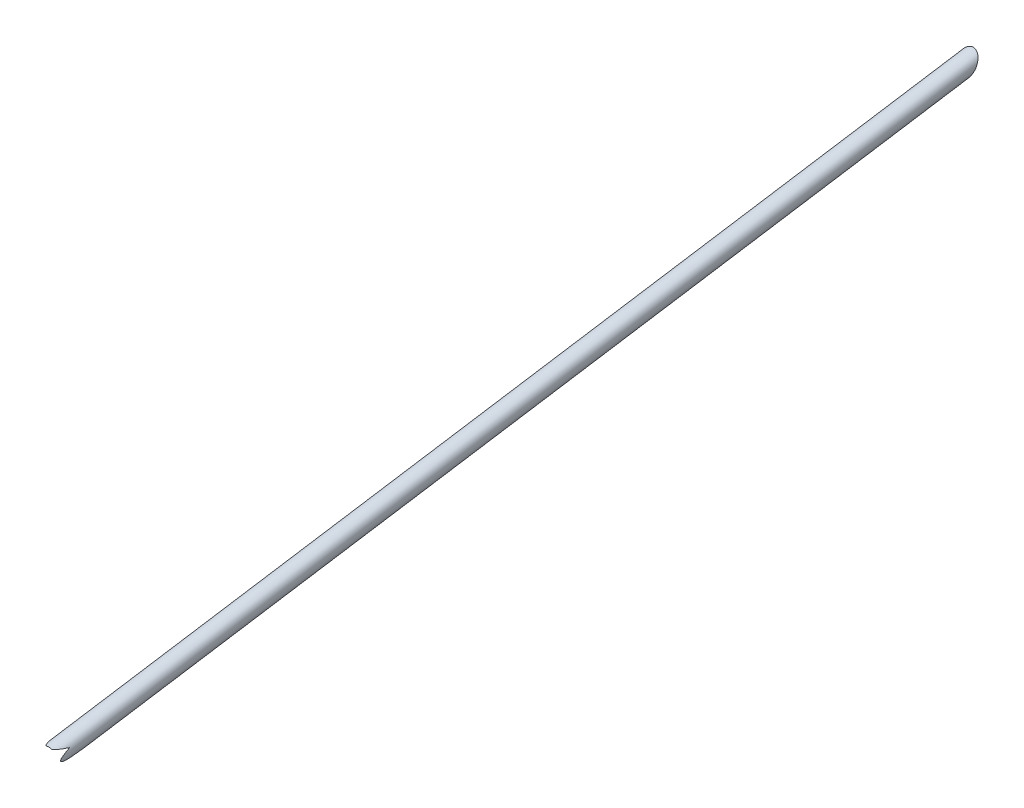
ISO-10303-21;
HEADER;
FILE_DESCRIPTION(('STEP AP214'),'2;1');
FILE_NAME('part.step','',(''),(''),'','','');
FILE_SCHEMA(('AUTOMOTIVE_DESIGN { 1 0 10303 214 1 1 1 1 }'));
ENDSEC;
DATA;
#1=APPLICATION_CONTEXT('core data for automotive mechanical design processes');
#2=APPLICATION_PROTOCOL_DEFINITION('international standard','automotive_design',2000,#1);
#3=PRODUCT_CONTEXT('',#1,'mechanical');
#4=PRODUCT('Part','Part','',(#3));
#5=PRODUCT_RELATED_PRODUCT_CATEGORY('part','',(#4));
#6=PRODUCT_DEFINITION_FORMATION('','',#4);
#7=PRODUCT_DEFINITION_CONTEXT('part definition',#1,'design');
#8=PRODUCT_DEFINITION('design','',#6,#7);
#9=PRODUCT_DEFINITION_SHAPE('','',#8);
#10=(LENGTH_UNIT() NAMED_UNIT(*) SI_UNIT(.MILLI.,.METRE.));
#11=(NAMED_UNIT(*) PLANE_ANGLE_UNIT() SI_UNIT($,.RADIAN.));
#12=(NAMED_UNIT(*) SI_UNIT($,.STERADIAN.) SOLID_ANGLE_UNIT());
#13=UNCERTAINTY_MEASURE_WITH_UNIT(LENGTH_MEASURE(1.E-05),#10,'distance_accuracy_value','');
#14=(GEOMETRIC_REPRESENTATION_CONTEXT(3) GLOBAL_UNCERTAINTY_ASSIGNED_CONTEXT((#13)) GLOBAL_UNIT_ASSIGNED_CONTEXT((#10,
#11,#12)) REPRESENTATION_CONTEXT('',''));
#15=CARTESIAN_POINT('',(0.,0.,0.));
#16=DIRECTION('',(0.,0.,1.));
#17=DIRECTION('',(1.,0.,0.));
#18=AXIS2_PLACEMENT_3D('',#15,#16,#17);
#19=CARTESIAN_POINT('',(150.,2.22044604925031E-13,-825.));
#20=DIRECTION('',(0.20871080944,0.381642622975999,-0.900438063583998));
#21=DIRECTION('',(0.,0.920714591276893,0.390236647958419));
#22=AXIS2_PLACEMENT_3D('',#19,#20,#21);
#23=CYLINDRICAL_SURFACE('',#22,7.90000000000002);
#24=CARTESIAN_POINT('',(169.854654537304,36.305654011071,-910.65865243237));
#25=DIRECTION('',(-0.993532672656404,0.,-0.113546591160732));
#26=DIRECTION('',(0.104852236740751,0.383768850271771,-0.917457071481573));
#27=AXIS2_PLACEMENT_3D('',#24,#25,#26);
#28=ELLIPSE('',#27,75.1526819648488,7.90000000000002);
#29=CARTESIAN_POINT('',(164.232637393375,10.,-861.466002422995));
#30=VERTEX_POINT('',#29);
#31=CARTESIAN_POINT('',(162.115990749984,10.,-842.945344293321));
#32=VERTEX_POINT('',#31);
#33=EDGE_CURVE('E88',#30,#32,#28,.T.);
#34=ORIENTED_EDGE('',*,*,#33,.T.);
#35=CARTESIAN_POINT('',(155.46875,10.,-848.59375));
#36=DIRECTION('',(0.,-1.,0.));
#37=DIRECTION('',(0.225801752353741,0.,-0.974173274440425));
#38=AXIS2_PLACEMENT_3D('',#35,#36,#37);
#39=ELLIPSE('',#38,20.6999939849403,7.90000000000002);
#40=EDGE_CURVE('E96',#32,#30,#39,.T.);
#41=ORIENTED_EDGE('',*,*,#40,.T.);
#42=EDGE_LOOP('',(#34,#41));
#43=FACE_BOUND('',#42,.T.);
#44=CARTESIAN_POINT('',(325.,320.,-1580.));
#45=DIRECTION('',(-0.00416950723616232,-0.393939167319851,-0.919127057408686));
#46=DIRECTION('',(0.2871987901008,0.87994037819309,-0.37844654284329));
#47=AXIS2_PLACEMENT_3D('',#44,#45,#46);
#48=ELLIPSE('',#47,11.6794314327941,7.90000000000002);
#49=CARTESIAN_POINT('',(328.354318576564,330.277203312053,-1584.42004044812));
#50=VERTEX_POINT('',#49);
#51=EDGE_CURVE('E43',#50,#50,#48,.T.);
#52=ORIENTED_EDGE('',*,*,#51,.T.);
#53=EDGE_LOOP('',(#52));
#54=FACE_BOUND('',#53,.T.);
#55=ADVANCED_FACE('F39',(#43,#54),#23,.F.);
#56=CARTESIAN_POINT('',(150.,2.22044604925031E-13,-825.));
#57=DIRECTION('',(0.20871080944,0.381642622975999,-0.900438063583998));
#58=DIRECTION('',(0.,0.920714591276893,0.390236647958419));
#59=AXIS2_PLACEMENT_3D('',#56,#57,#58);
#60=CYLINDRICAL_SURFACE('',#59,9.49999999999999);
#61=CARTESIAN_POINT('',(169.854654537304,36.305654011071,-910.65865243237));
#62=DIRECTION('',(-0.993532672656404,0.,-0.113546591160732));
#63=DIRECTION('',(0.104852236740751,0.383768850271771,-0.917457071481573));
#64=AXIS2_PLACEMENT_3D('',#61,#62,#63);
#65=ELLIPSE('',#64,90.3734783121596,9.49999999999999);
#66=CARTESIAN_POINT('',(165.021102330899,10.,-868.365070626321));
#67=VERTEX_POINT('',#66);
#68=CARTESIAN_POINT('',(161.327525812461,10.,-836.046276089994));
#69=VERTEX_POINT('',#68);
#70=EDGE_CURVE('E86',#67,#69,#65,.T.);
#71=ORIENTED_EDGE('',*,*,#70,.F.);
#72=CARTESIAN_POINT('',(155.46875,10.,-848.59375));
#73=DIRECTION('',(0.,-1.,0.));
#74=DIRECTION('',(0.225801752353741,0.,-0.974173274440425));
#75=AXIS2_PLACEMENT_3D('',#72,#73,#74);
#76=ELLIPSE('',#75,24.8923978299914,9.49999999999999);
#77=CARTESIAN_POINT('',(147.853219182832,10.,-825.504602960222));
#78=VERTEX_POINT('',#77);
#79=EDGE_CURVE('E71',#78,#67,#76,.T.);
#80=ORIENTED_EDGE('',*,*,#79,.F.);
#81=CARTESIAN_POINT('',(150.,3.38448164180527E-13,-825.));
#82=DIRECTION('',(0.0197141066523152,-0.0461644942318043,-0.998739302055958));
#83=DIRECTION('',(0.412111349099456,0.910500714966001,-0.0339512001235191));
#84=AXIS2_PLACEMENT_3D('',#81,#82,#83);
#85=ELLIPSE('',#84,10.7247795684855,9.49999999999999);
#86=CARTESIAN_POINT('',(153.842522857189,10.,-825.386380145553));
#87=VERTEX_POINT('',#86);
#88=EDGE_CURVE('E49',#87,#78,#85,.F.);
#89=ORIENTED_EDGE('',*,*,#88,.F.);
#90=EDGE_CURVE('E82',#69,#87,#76,.T.);
#91=ORIENTED_EDGE('',*,*,#90,.F.);
#92=EDGE_LOOP('',(#71,#80,#89,#91));
#93=FACE_BOUND('',#92,.T.);
#94=CARTESIAN_POINT('',(325.,320.,-1580.));
#95=DIRECTION('',(-0.00416950723616232,-0.393939167319851,-0.919127057408686));
#96=DIRECTION('',(0.2871987901008,0.87994037819309,-0.37844654284329));
#97=AXIS2_PLACEMENT_3D('',#94,#95,#96);
#98=ELLIPSE('',#97,14.0448859001954,9.49999999999999);
#99=CARTESIAN_POINT('',(329.03367423764,332.358662210697,-1585.31523851356));
#100=VERTEX_POINT('',#99);
#101=EDGE_CURVE('E11',#100,#100,#98,.T.);
#102=ORIENTED_EDGE('',*,*,#101,.F.);
#103=EDGE_LOOP('',(#102));
#104=FACE_BOUND('',#103,.T.);
#105=ADVANCED_FACE('F92',(#93,#104),#60,.T.);
#106=CARTESIAN_POINT('',(160.,10.,-825.));
#107=DIRECTION('',(0.,-1.,0.));
#108=DIRECTION('',(0.,0.,-1.));
#109=AXIS2_PLACEMENT_3D('',#106,#107,#108);
#110=PLANE('',#109);
#111=DIRECTION('',(-0.113546591160732,0.,0.993532672656404));
#112=VECTOR('',#111,1.);
#113=CARTESIAN_POINT('',(259.935326726564,10.,-1698.86453408839));
#114=LINE('',#113,#112);
#115=EDGE_CURVE('E90',#32,#69,#114,.T.);
#116=ORIENTED_EDGE('',*,*,#115,.T.);
#117=ORIENTED_EDGE('',*,*,#90,.T.);
#118=CARTESIAN_POINT('',(153.75,10.,-806.250000000001));
#119=DIRECTION('',(0.,-1.,0.));
#120=DIRECTION('',(-0.196116135138185,0.,-0.98058067569092));
#121=AXIS2_PLACEMENT_3D('',#118,#119,#120);
#122=ELLIPSE('',#121,20.4994283456881,9.49999999999999);
#123=EDGE_CURVE('E56',#87,#78,#122,.F.);
#124=ORIENTED_EDGE('',*,*,#123,.T.);
#125=ORIENTED_EDGE('',*,*,#79,.T.);
#126=EDGE_CURVE('E76',#67,#30,#114,.T.);
#127=ORIENTED_EDGE('',*,*,#126,.T.);
#128=ORIENTED_EDGE('',*,*,#40,.F.);
#129=EDGE_LOOP('',(#116,#117,#124,#125,#127,#128));
#130=FACE_BOUND('',#129,.T.);
#131=ADVANCED_FACE('F74',(#130),#110,.T.);
#132=CARTESIAN_POINT('',(259.935326726564,10.,-1698.86453408839));
#133=DIRECTION('',(-0.993532672656404,0.,-0.113546591160732));
#134=DIRECTION('',(-0.113546591160732,0.,0.993532672656404));
#135=AXIS2_PLACEMENT_3D('',#132,#133,#134);
#136=PLANE('',#135);
#137=ORIENTED_EDGE('',*,*,#126,.F.);
#138=ORIENTED_EDGE('',*,*,#70,.T.);
#139=ORIENTED_EDGE('',*,*,#115,.F.);
#140=ORIENTED_EDGE('',*,*,#33,.F.);
#141=EDGE_LOOP('',(#137,#138,#139,#140));
#142=FACE_BOUND('',#141,.T.);
#143=ADVANCED_FACE('F84',(#142),#136,.T.);
#144=CARTESIAN_POINT('',(225.,200.,-450.000000000001));
#145=DIRECTION('',(-0.173785333909048,-0.463427557090794,-0.868926669545238));
#146=DIRECTION('',(0.,0.882352941176471,-0.470588235294118));
#147=AXIS2_PLACEMENT_3D('',#144,#145,#146);
#148=CYLINDRICAL_SURFACE('',#147,9.49999999999999);
#149=ORIENTED_EDGE('',*,*,#88,.T.);
#150=ORIENTED_EDGE('',*,*,#123,.F.);
#151=EDGE_LOOP('',(#149,#150));
#152=FACE_BOUND('',#151,.T.);
#153=ADVANCED_FACE('F105',(#152),#148,.F.);
#154=CARTESIAN_POINT('',(325.,320.,-1580.));
#155=DIRECTION('',(-0.00416950723616232,-0.393939167319851,-0.919127057408686));
#156=DIRECTION('',(0.,0.919135046928569,-0.393942591639465));
#157=AXIS2_PLACEMENT_3D('',#154,#155,#156);
#158=PLANE('',#157);
#159=ORIENTED_EDGE('',*,*,#51,.F.);
#160=EDGE_LOOP('',(#159));
#161=FACE_BOUND('',#160,.T.);
#162=ORIENTED_EDGE('',*,*,#101,.T.);
#163=EDGE_LOOP('',(#162));
#164=FACE_BOUND('',#163,.T.);
#165=ADVANCED_FACE('F41',(#161,#164),#158,.T.);
#166=CLOSED_SHELL('',(#55,#105,#131,#143,#153,#165));
#167=MANIFOLD_SOLID_BREP('B2',#166);
#168=ADVANCED_BREP_SHAPE_REPRESENTATION('',(#18,#167),#14);
#169=SHAPE_DEFINITION_REPRESENTATION(#9,#168);
ENDSEC;
END-ISO-10303-21;
